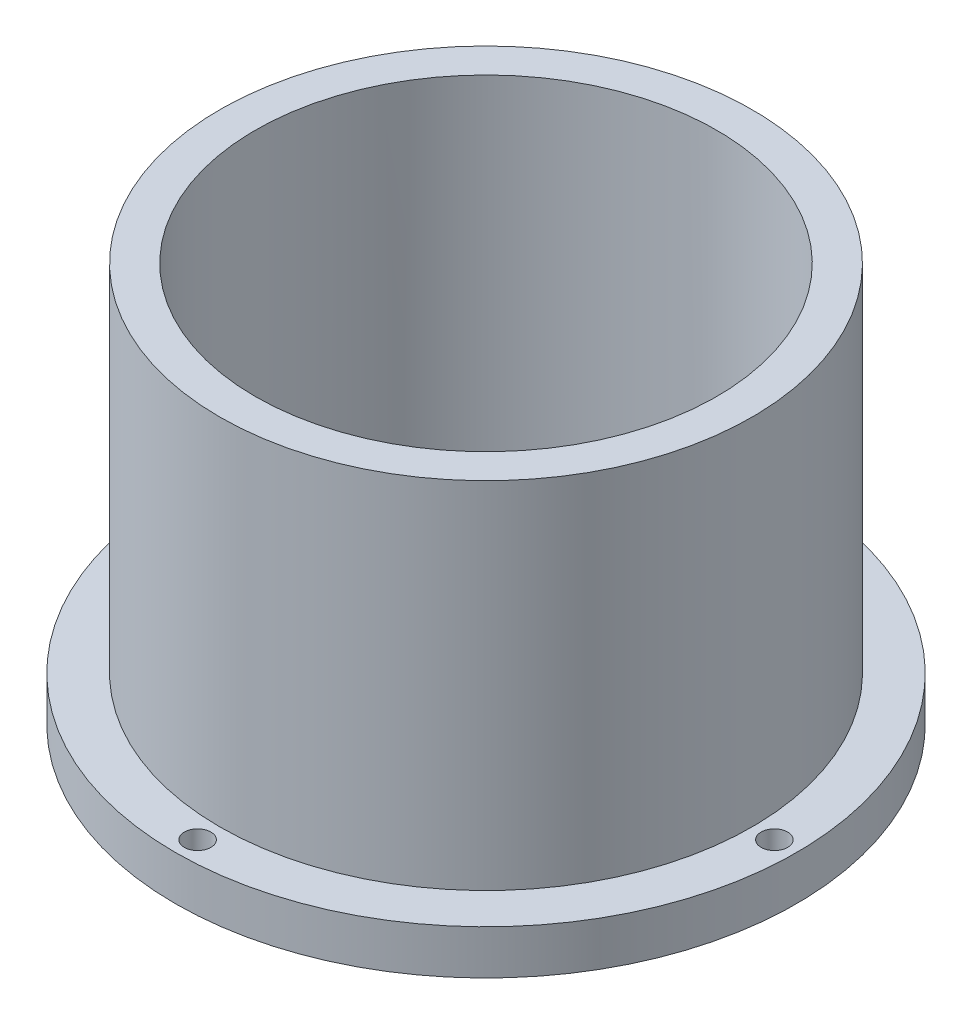
ISO-10303-21;
HEADER;
FILE_DESCRIPTION(('STEP AP214'),'2;1');
FILE_NAME('part.step','',(''),(''),'','','');
FILE_SCHEMA(('AUTOMOTIVE_DESIGN { 1 0 10303 214 1 1 1 1 }'));
ENDSEC;
DATA;
#1=APPLICATION_CONTEXT('core data for automotive mechanical design processes');
#2=APPLICATION_PROTOCOL_DEFINITION('international standard','automotive_design',2000,#1);
#3=PRODUCT_CONTEXT('',#1,'mechanical');
#4=PRODUCT('Part','Part','',(#3));
#5=PRODUCT_RELATED_PRODUCT_CATEGORY('part','',(#4));
#6=PRODUCT_DEFINITION_FORMATION('','',#4);
#7=PRODUCT_DEFINITION_CONTEXT('part definition',#1,'design');
#8=PRODUCT_DEFINITION('design','',#6,#7);
#9=PRODUCT_DEFINITION_SHAPE('','',#8);
#10=(LENGTH_UNIT() NAMED_UNIT(*) SI_UNIT(.MILLI.,.METRE.));
#11=(NAMED_UNIT(*) PLANE_ANGLE_UNIT() SI_UNIT($,.RADIAN.));
#12=(NAMED_UNIT(*) SI_UNIT($,.STERADIAN.) SOLID_ANGLE_UNIT());
#13=UNCERTAINTY_MEASURE_WITH_UNIT(LENGTH_MEASURE(1.E-05),#10,'distance_accuracy_value','');
#14=(GEOMETRIC_REPRESENTATION_CONTEXT(3) GLOBAL_UNCERTAINTY_ASSIGNED_CONTEXT((#13)) GLOBAL_UNIT_ASSIGNED_CONTEXT((#10,
#11,#12)) REPRESENTATION_CONTEXT('',''));
#15=CARTESIAN_POINT('',(0.,0.,0.));
#16=DIRECTION('',(0.,0.,1.));
#17=DIRECTION('',(1.,0.,0.));
#18=AXIS2_PLACEMENT_3D('',#15,#16,#17);
#19=CARTESIAN_POINT('',(0.,-15.,0.));
#20=DIRECTION('',(0.,1.,0.));
#21=DIRECTION('',(0.,0.,1.));
#22=AXIS2_PLACEMENT_3D('',#19,#20,#21);
#23=CYLINDRICAL_SURFACE('',#22,26.);
#24=CARTESIAN_POINT('',(0.,45.,0.));
#25=DIRECTION('',(0.,1.,0.));
#26=DIRECTION('',(0.,0.,1.));
#27=AXIS2_PLACEMENT_3D('',#24,#25,#26);
#28=CIRCLE('',#27,26.);
#29=CARTESIAN_POINT('',(0.,45.,26.));
#30=VERTEX_POINT('',#29);
#31=EDGE_CURVE('E60',#30,#30,#28,.T.);
#32=ORIENTED_EDGE('',*,*,#31,.T.);
#33=EDGE_LOOP('',(#32));
#34=FACE_BOUND('',#33,.T.);
#35=CARTESIAN_POINT('',(0.,5.,0.));
#36=DIRECTION('',(0.,-1.,0.));
#37=DIRECTION('',(0.,0.,-1.));
#38=AXIS2_PLACEMENT_3D('',#35,#36,#37);
#39=CIRCLE('',#38,26.);
#40=CARTESIAN_POINT('',(0.,5.,-26.));
#41=VERTEX_POINT('',#40);
#42=EDGE_CURVE('E10',#41,#41,#39,.F.);
#43=ORIENTED_EDGE('',*,*,#42,.F.);
#44=EDGE_LOOP('',(#43));
#45=FACE_BOUND('',#44,.T.);
#46=ADVANCED_FACE('F35',(#34,#45),#23,.F.);
#47=CARTESIAN_POINT('',(0.,5.,0.));
#48=DIRECTION('',(0.,-1.,0.));
#49=DIRECTION('',(0.,0.,-1.));
#50=AXIS2_PLACEMENT_3D('',#47,#48,#49);
#51=CYLINDRICAL_SURFACE('',#50,35.);
#52=CARTESIAN_POINT('',(0.,5.,0.));
#53=DIRECTION('',(0.,1.,0.));
#54=DIRECTION('',(0.,0.,1.));
#55=AXIS2_PLACEMENT_3D('',#52,#53,#54);
#56=CIRCLE('',#55,35.);
#57=CARTESIAN_POINT('',(0.,5.,35.));
#58=VERTEX_POINT('',#57);
#59=EDGE_CURVE('E46',#58,#58,#56,.T.);
#60=ORIENTED_EDGE('',*,*,#59,.F.);
#61=EDGE_LOOP('',(#60));
#62=FACE_BOUND('',#61,.T.);
#63=CARTESIAN_POINT('',(0.,0.,0.));
#64=DIRECTION('',(0.,1.,0.));
#65=DIRECTION('',(0.,0.,1.));
#66=AXIS2_PLACEMENT_3D('',#63,#64,#65);
#67=CIRCLE('',#66,35.);
#68=CARTESIAN_POINT('',(0.,0.,35.));
#69=VERTEX_POINT('',#68);
#70=EDGE_CURVE('E51',#69,#69,#67,.T.);
#71=ORIENTED_EDGE('',*,*,#70,.T.);
#72=EDGE_LOOP('',(#71));
#73=FACE_BOUND('',#72,.T.);
#74=ADVANCED_FACE('F37',(#62,#73),#51,.T.);
#75=CARTESIAN_POINT('',(0.,5.,0.));
#76=DIRECTION('',(0.,1.,0.));
#77=DIRECTION('',(0.,0.,1.));
#78=AXIS2_PLACEMENT_3D('',#75,#76,#77);
#79=PLANE('',#78);
#80=CARTESIAN_POINT('',(0.,5.,32.5));
#81=DIRECTION('',(0.,1.,0.));
#82=DIRECTION('',(0.,0.,1.));
#83=AXIS2_PLACEMENT_3D('',#80,#81,#82);
#84=CIRCLE('',#83,1.5);
#85=CARTESIAN_POINT('',(0.,5.,34.));
#86=VERTEX_POINT('',#85);
#87=EDGE_CURVE('E64',#86,#86,#84,.T.);
#88=ORIENTED_EDGE('',*,*,#87,.F.);
#89=EDGE_LOOP('',(#88));
#90=FACE_BOUND('',#89,.T.);
#91=CARTESIAN_POINT('',(32.5,5.,0.));
#92=DIRECTION('',(0.,1.,0.));
#93=DIRECTION('',(0.,0.,1.));
#94=AXIS2_PLACEMENT_3D('',#91,#92,#93);
#95=CIRCLE('',#94,1.5);
#96=CARTESIAN_POINT('',(32.5,5.,1.5));
#97=VERTEX_POINT('',#96);
#98=EDGE_CURVE('E68',#97,#97,#95,.T.);
#99=ORIENTED_EDGE('',*,*,#98,.F.);
#100=EDGE_LOOP('',(#99));
#101=FACE_BOUND('',#100,.T.);
#102=CARTESIAN_POINT('',(0.,5.,-32.5));
#103=DIRECTION('',(0.,1.,0.));
#104=DIRECTION('',(0.,0.,1.));
#105=AXIS2_PLACEMENT_3D('',#102,#103,#104);
#106=CIRCLE('',#105,1.5);
#107=CARTESIAN_POINT('',(0.,5.,-31.));
#108=VERTEX_POINT('',#107);
#109=EDGE_CURVE('E73',#108,#108,#106,.T.);
#110=ORIENTED_EDGE('',*,*,#109,.F.);
#111=EDGE_LOOP('',(#110));
#112=FACE_BOUND('',#111,.T.);
#113=CARTESIAN_POINT('',(-32.5,5.,0.));
#114=DIRECTION('',(0.,1.,0.));
#115=DIRECTION('',(0.,0.,1.));
#116=AXIS2_PLACEMENT_3D('',#113,#114,#115);
#117=CIRCLE('',#116,1.5);
#118=CARTESIAN_POINT('',(-32.5,5.,1.5));
#119=VERTEX_POINT('',#118);
#120=EDGE_CURVE('E76',#119,#119,#117,.T.);
#121=ORIENTED_EDGE('',*,*,#120,.F.);
#122=EDGE_LOOP('',(#121));
#123=FACE_BOUND('',#122,.T.);
#124=CARTESIAN_POINT('',(0.,5.,0.));
#125=DIRECTION('',(0.,1.,0.));
#126=DIRECTION('',(0.,0.,1.));
#127=AXIS2_PLACEMENT_3D('',#124,#125,#126);
#128=CIRCLE('',#127,30.);
#129=CARTESIAN_POINT('',(0.,5.,30.));
#130=VERTEX_POINT('',#129);
#131=EDGE_CURVE('E42',#130,#130,#128,.T.);
#132=ORIENTED_EDGE('',*,*,#131,.F.);
#133=EDGE_LOOP('',(#132));
#134=FACE_BOUND('',#133,.T.);
#135=ORIENTED_EDGE('',*,*,#59,.T.);
#136=EDGE_LOOP('',(#135));
#137=FACE_BOUND('',#136,.T.);
#138=ADVANCED_FACE('F98',(#90,#101,#112,#123,#134,#137),#79,.T.);
#139=CARTESIAN_POINT('',(0.,0.,0.));
#140=DIRECTION('',(0.,1.,0.));
#141=DIRECTION('',(0.,0.,1.));
#142=AXIS2_PLACEMENT_3D('',#139,#140,#141);
#143=PLANE('',#142);
#144=CARTESIAN_POINT('',(0.,0.,32.5));
#145=DIRECTION('',(0.,-1.,0.));
#146=DIRECTION('',(0.,0.,-1.));
#147=AXIS2_PLACEMENT_3D('',#144,#145,#146);
#148=CIRCLE('',#147,1.5);
#149=CARTESIAN_POINT('',(0.,0.,31.));
#150=VERTEX_POINT('',#149);
#151=EDGE_CURVE('E79',#150,#150,#148,.T.);
#152=ORIENTED_EDGE('',*,*,#151,.F.);
#153=EDGE_LOOP('',(#152));
#154=FACE_BOUND('',#153,.T.);
#155=CARTESIAN_POINT('',(32.5,0.,0.));
#156=DIRECTION('',(0.,-1.,0.));
#157=DIRECTION('',(0.,0.,-1.));
#158=AXIS2_PLACEMENT_3D('',#155,#156,#157);
#159=CIRCLE('',#158,1.5);
#160=CARTESIAN_POINT('',(32.5,0.,-1.5));
#161=VERTEX_POINT('',#160);
#162=EDGE_CURVE('E86',#161,#161,#159,.T.);
#163=ORIENTED_EDGE('',*,*,#162,.F.);
#164=EDGE_LOOP('',(#163));
#165=FACE_BOUND('',#164,.T.);
#166=CARTESIAN_POINT('',(0.,0.,-32.5));
#167=DIRECTION('',(0.,-1.,0.));
#168=DIRECTION('',(0.,0.,-1.));
#169=AXIS2_PLACEMENT_3D('',#166,#167,#168);
#170=CIRCLE('',#169,1.5);
#171=CARTESIAN_POINT('',(0.,0.,-34.));
#172=VERTEX_POINT('',#171);
#173=EDGE_CURVE('E83',#172,#172,#170,.T.);
#174=ORIENTED_EDGE('',*,*,#173,.F.);
#175=EDGE_LOOP('',(#174));
#176=FACE_BOUND('',#175,.T.);
#177=CARTESIAN_POINT('',(-32.5,0.,0.));
#178=DIRECTION('',(0.,-1.,0.));
#179=DIRECTION('',(0.,0.,-1.));
#180=AXIS2_PLACEMENT_3D('',#177,#178,#179);
#181=CIRCLE('',#180,1.5);
#182=CARTESIAN_POINT('',(-32.5,0.,-1.5));
#183=VERTEX_POINT('',#182);
#184=EDGE_CURVE('E80',#183,#183,#181,.T.);
#185=ORIENTED_EDGE('',*,*,#184,.F.);
#186=EDGE_LOOP('',(#185));
#187=FACE_BOUND('',#186,.T.);
#188=ORIENTED_EDGE('',*,*,#70,.F.);
#189=EDGE_LOOP('',(#188));
#190=FACE_BOUND('',#189,.T.);
#191=ADVANCED_FACE('F94',(#154,#165,#176,#187,#190),#143,.F.);
#192=CARTESIAN_POINT('',(0.,45.,0.));
#193=DIRECTION('',(0.,-1.,0.));
#194=DIRECTION('',(0.,0.,-1.));
#195=AXIS2_PLACEMENT_3D('',#192,#193,#194);
#196=CYLINDRICAL_SURFACE('',#195,30.);
#197=CARTESIAN_POINT('',(0.,45.,0.));
#198=DIRECTION('',(0.,1.,0.));
#199=DIRECTION('',(0.,0.,1.));
#200=AXIS2_PLACEMENT_3D('',#197,#198,#199);
#201=CIRCLE('',#200,30.);
#202=CARTESIAN_POINT('',(0.,45.,30.));
#203=VERTEX_POINT('',#202);
#204=EDGE_CURVE('E54',#203,#203,#201,.T.);
#205=ORIENTED_EDGE('',*,*,#204,.F.);
#206=EDGE_LOOP('',(#205));
#207=FACE_BOUND('',#206,.T.);
#208=ORIENTED_EDGE('',*,*,#131,.T.);
#209=EDGE_LOOP('',(#208));
#210=FACE_BOUND('',#209,.T.);
#211=ADVANCED_FACE('F97',(#207,#210),#196,.T.);
#212=CARTESIAN_POINT('',(0.,45.,0.));
#213=DIRECTION('',(0.,1.,0.));
#214=DIRECTION('',(0.,0.,1.));
#215=AXIS2_PLACEMENT_3D('',#212,#213,#214);
#216=PLANE('',#215);
#217=ORIENTED_EDGE('',*,*,#31,.F.);
#218=EDGE_LOOP('',(#217));
#219=FACE_BOUND('',#218,.T.);
#220=ORIENTED_EDGE('',*,*,#204,.T.);
#221=EDGE_LOOP('',(#220));
#222=FACE_BOUND('',#221,.T.);
#223=ADVANCED_FACE('F109',(#219,#222),#216,.T.);
#224=CARTESIAN_POINT('',(-32.5,60.,0.));
#225=DIRECTION('',(0.,-1.,0.));
#226=DIRECTION('',(0.,0.,-1.));
#227=AXIS2_PLACEMENT_3D('',#224,#225,#226);
#228=CYLINDRICAL_SURFACE('',#227,1.5);
#229=ORIENTED_EDGE('',*,*,#120,.T.);
#230=EDGE_LOOP('',(#229));
#231=FACE_BOUND('',#230,.T.);
#232=ORIENTED_EDGE('',*,*,#184,.T.);
#233=EDGE_LOOP('',(#232));
#234=FACE_BOUND('',#233,.T.);
#235=ADVANCED_FACE('F106',(#231,#234),#228,.F.);
#236=CARTESIAN_POINT('',(0.,60.,-32.5));
#237=DIRECTION('',(0.,-1.,0.));
#238=DIRECTION('',(0.,0.,-1.));
#239=AXIS2_PLACEMENT_3D('',#236,#237,#238);
#240=CYLINDRICAL_SURFACE('',#239,1.5);
#241=ORIENTED_EDGE('',*,*,#109,.T.);
#242=EDGE_LOOP('',(#241));
#243=FACE_BOUND('',#242,.T.);
#244=ORIENTED_EDGE('',*,*,#173,.T.);
#245=EDGE_LOOP('',(#244));
#246=FACE_BOUND('',#245,.T.);
#247=ADVANCED_FACE('F108',(#243,#246),#240,.F.);
#248=CARTESIAN_POINT('',(32.5,60.,0.));
#249=DIRECTION('',(0.,-1.,0.));
#250=DIRECTION('',(0.,0.,-1.));
#251=AXIS2_PLACEMENT_3D('',#248,#249,#250);
#252=CYLINDRICAL_SURFACE('',#251,1.5);
#253=ORIENTED_EDGE('',*,*,#98,.T.);
#254=EDGE_LOOP('',(#253));
#255=FACE_BOUND('',#254,.T.);
#256=ORIENTED_EDGE('',*,*,#162,.T.);
#257=EDGE_LOOP('',(#256));
#258=FACE_BOUND('',#257,.T.);
#259=ADVANCED_FACE('F116',(#255,#258),#252,.F.);
#260=CARTESIAN_POINT('',(0.,60.,32.5));
#261=DIRECTION('',(0.,-1.,0.));
#262=DIRECTION('',(0.,0.,-1.));
#263=AXIS2_PLACEMENT_3D('',#260,#261,#262);
#264=CYLINDRICAL_SURFACE('',#263,1.5);
#265=ORIENTED_EDGE('',*,*,#87,.T.);
#266=EDGE_LOOP('',(#265));
#267=FACE_BOUND('',#266,.T.);
#268=ORIENTED_EDGE('',*,*,#151,.T.);
#269=EDGE_LOOP('',(#268));
#270=FACE_BOUND('',#269,.T.);
#271=ADVANCED_FACE('F92',(#267,#270),#264,.F.);
#272=CARTESIAN_POINT('',(0.,5.,0.));
#273=DIRECTION('',(0.,-1.,0.));
#274=DIRECTION('',(0.,0.,-1.));
#275=AXIS2_PLACEMENT_3D('',#272,#273,#274);
#276=PLANE('',#275);
#277=ORIENTED_EDGE('',*,*,#42,.T.);
#278=EDGE_LOOP('',(#277));
#279=FACE_BOUND('',#278,.T.);
#280=ADVANCED_FACE('F154',(#279),#276,.F.);
#281=CLOSED_SHELL('',(#46,#74,#138,#191,#211,#223,#235,#247,#259,#271,#280));
#282=MANIFOLD_SOLID_BREP('B2',#281);
#283=ADVANCED_BREP_SHAPE_REPRESENTATION('',(#18,#282),#14);
#284=SHAPE_DEFINITION_REPRESENTATION(#9,#283);
ENDSEC;
END-ISO-10303-21;
